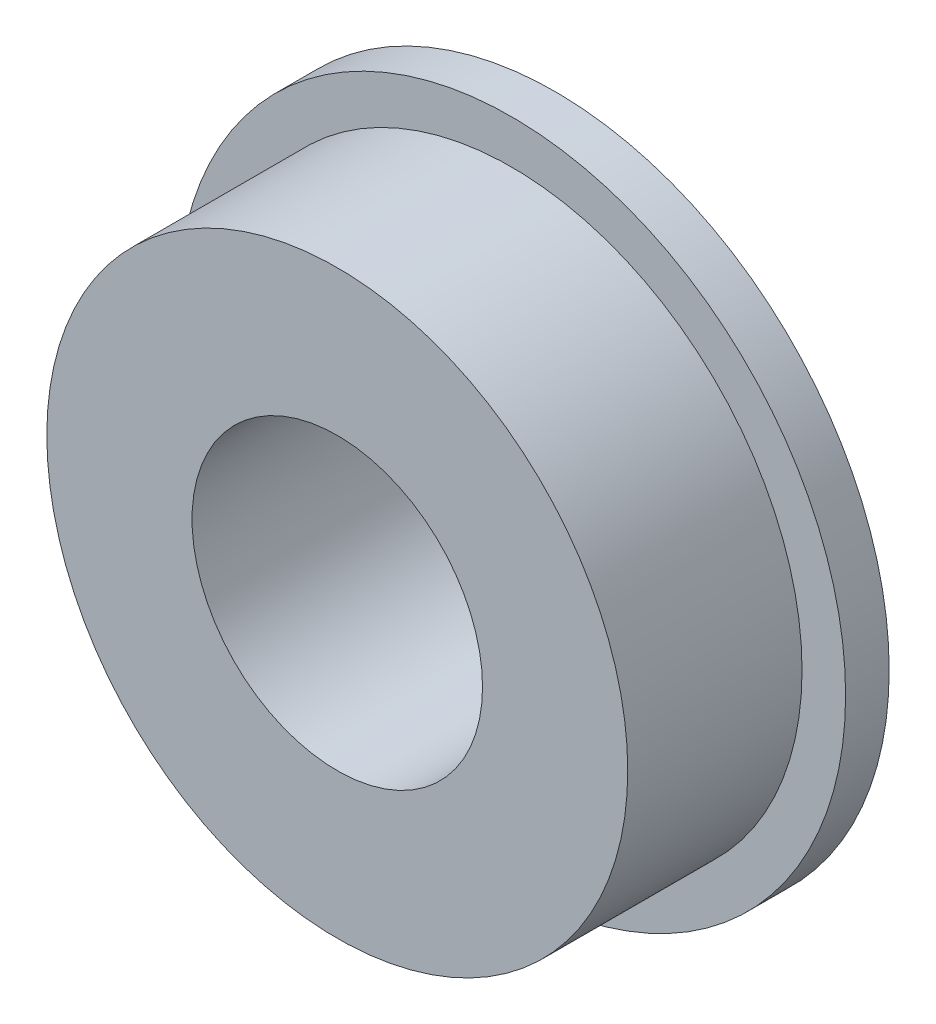
ISO-10303-21;
HEADER;
FILE_DESCRIPTION(('STEP AP214'),'2;1');
FILE_NAME('part.step','',(''),(''),'','','');
FILE_SCHEMA(('AUTOMOTIVE_DESIGN { 1 0 10303 214 1 1 1 1 }'));
ENDSEC;
DATA;
#1=APPLICATION_CONTEXT('core data for automotive mechanical design processes');
#2=APPLICATION_PROTOCOL_DEFINITION('international standard','automotive_design',2000,#1);
#3=PRODUCT_CONTEXT('',#1,'mechanical');
#4=PRODUCT('Part','Part','',(#3));
#5=PRODUCT_RELATED_PRODUCT_CATEGORY('part','',(#4));
#6=PRODUCT_DEFINITION_FORMATION('','',#4);
#7=PRODUCT_DEFINITION_CONTEXT('part definition',#1,'design');
#8=PRODUCT_DEFINITION('design','',#6,#7);
#9=PRODUCT_DEFINITION_SHAPE('','',#8);
#10=(LENGTH_UNIT() NAMED_UNIT(*) SI_UNIT(.MILLI.,.METRE.));
#11=(NAMED_UNIT(*) PLANE_ANGLE_UNIT() SI_UNIT($,.RADIAN.));
#12=(NAMED_UNIT(*) SI_UNIT($,.STERADIAN.) SOLID_ANGLE_UNIT());
#13=UNCERTAINTY_MEASURE_WITH_UNIT(LENGTH_MEASURE(1.E-05),#10,'distance_accuracy_value','');
#14=(GEOMETRIC_REPRESENTATION_CONTEXT(3) GLOBAL_UNCERTAINTY_ASSIGNED_CONTEXT((#13)) GLOBAL_UNIT_ASSIGNED_CONTEXT((#10,
#11,#12)) REPRESENTATION_CONTEXT('',''));
#15=CARTESIAN_POINT('',(0.,0.,0.));
#16=DIRECTION('',(0.,0.,1.));
#17=DIRECTION('',(1.,0.,0.));
#18=AXIS2_PLACEMENT_3D('',#15,#16,#17);
#19=CARTESIAN_POINT('',(0.,0.,0.6));
#20=DIRECTION('',(0.,0.,-1.));
#21=DIRECTION('',(-1.,0.,0.));
#22=AXIS2_PLACEMENT_3D('',#19,#20,#21);
#23=CYLINDRICAL_SURFACE('',#22,4.6);
#24=CARTESIAN_POINT('',(0.,0.,0.6));
#25=DIRECTION('',(0.,0.,1.));
#26=DIRECTION('',(1.,0.,0.));
#27=AXIS2_PLACEMENT_3D('',#24,#25,#26);
#28=CIRCLE('',#27,4.6);
#29=CARTESIAN_POINT('',(4.6,0.,0.6));
#30=VERTEX_POINT('',#29);
#31=EDGE_CURVE('E10',#30,#30,#28,.T.);
#32=ORIENTED_EDGE('',*,*,#31,.F.);
#33=EDGE_LOOP('',(#32));
#34=FACE_BOUND('',#33,.T.);
#35=CARTESIAN_POINT('',(0.,0.,0.));
#36=DIRECTION('',(0.,0.,1.));
#37=DIRECTION('',(1.,0.,0.));
#38=AXIS2_PLACEMENT_3D('',#35,#36,#37);
#39=CIRCLE('',#38,4.6);
#40=CARTESIAN_POINT('',(4.6,0.,0.));
#41=VERTEX_POINT('',#40);
#42=EDGE_CURVE('E35',#41,#41,#39,.T.);
#43=ORIENTED_EDGE('',*,*,#42,.T.);
#44=EDGE_LOOP('',(#43));
#45=FACE_BOUND('',#44,.T.);
#46=ADVANCED_FACE('F32',(#34,#45),#23,.T.);
#47=CARTESIAN_POINT('',(0.,0.,0.6));
#48=DIRECTION('',(0.,0.,1.));
#49=DIRECTION('',(1.,0.,0.));
#50=AXIS2_PLACEMENT_3D('',#47,#48,#49);
#51=PLANE('',#50);
#52=CARTESIAN_POINT('',(0.,0.,0.6));
#53=DIRECTION('',(0.,0.,1.));
#54=DIRECTION('',(1.,0.,0.));
#55=AXIS2_PLACEMENT_3D('',#52,#53,#54);
#56=CIRCLE('',#55,4.);
#57=CARTESIAN_POINT('',(4.,0.,0.6));
#58=VERTEX_POINT('',#57);
#59=EDGE_CURVE('E44',#58,#58,#56,.T.);
#60=ORIENTED_EDGE('',*,*,#59,.F.);
#61=EDGE_LOOP('',(#60));
#62=FACE_BOUND('',#61,.T.);
#63=ORIENTED_EDGE('',*,*,#31,.T.);
#64=EDGE_LOOP('',(#63));
#65=FACE_BOUND('',#64,.T.);
#66=ADVANCED_FACE('F77',(#62,#65),#51,.T.);
#67=CARTESIAN_POINT('',(0.,0.,0.));
#68=DIRECTION('',(0.,0.,1.));
#69=DIRECTION('',(1.,0.,0.));
#70=AXIS2_PLACEMENT_3D('',#67,#68,#69);
#71=PLANE('',#70);
#72=CARTESIAN_POINT('',(0.,0.,0.));
#73=DIRECTION('',(0.,0.,1.));
#74=DIRECTION('',(1.,0.,0.));
#75=AXIS2_PLACEMENT_3D('',#72,#73,#74);
#76=CIRCLE('',#75,2.);
#77=CARTESIAN_POINT('',(2.,0.,0.));
#78=VERTEX_POINT('',#77);
#79=EDGE_CURVE('E47',#78,#78,#76,.T.);
#80=ORIENTED_EDGE('',*,*,#79,.T.);
#81=EDGE_LOOP('',(#80));
#82=FACE_BOUND('',#81,.T.);
#83=ORIENTED_EDGE('',*,*,#42,.F.);
#84=EDGE_LOOP('',(#83));
#85=FACE_BOUND('',#84,.T.);
#86=ADVANCED_FACE('F56',(#82,#85),#71,.F.);
#87=CARTESIAN_POINT('',(0.,0.,3.));
#88=DIRECTION('',(0.,0.,-1.));
#89=DIRECTION('',(-1.,0.,0.));
#90=AXIS2_PLACEMENT_3D('',#87,#88,#89);
#91=CYLINDRICAL_SURFACE('',#90,4.);
#92=CARTESIAN_POINT('',(0.,0.,3.));
#93=DIRECTION('',(0.,0.,1.));
#94=DIRECTION('',(1.,0.,0.));
#95=AXIS2_PLACEMENT_3D('',#92,#93,#94);
#96=CIRCLE('',#95,4.);
#97=CARTESIAN_POINT('',(4.,0.,3.));
#98=VERTEX_POINT('',#97);
#99=EDGE_CURVE('E42',#98,#98,#96,.T.);
#100=ORIENTED_EDGE('',*,*,#99,.F.);
#101=EDGE_LOOP('',(#100));
#102=FACE_BOUND('',#101,.T.);
#103=ORIENTED_EDGE('',*,*,#59,.T.);
#104=EDGE_LOOP('',(#103));
#105=FACE_BOUND('',#104,.T.);
#106=ADVANCED_FACE('F68',(#102,#105),#91,.T.);
#107=CARTESIAN_POINT('',(0.,0.,3.));
#108=DIRECTION('',(0.,0.,1.));
#109=DIRECTION('',(1.,0.,0.));
#110=AXIS2_PLACEMENT_3D('',#107,#108,#109);
#111=PLANE('',#110);
#112=CARTESIAN_POINT('',(0.,0.,3.));
#113=DIRECTION('',(0.,0.,1.));
#114=DIRECTION('',(1.,0.,0.));
#115=AXIS2_PLACEMENT_3D('',#112,#113,#114);
#116=CIRCLE('',#115,2.);
#117=CARTESIAN_POINT('',(2.,0.,3.));
#118=VERTEX_POINT('',#117);
#119=EDGE_CURVE('E50',#118,#118,#116,.T.);
#120=ORIENTED_EDGE('',*,*,#119,.F.);
#121=EDGE_LOOP('',(#120));
#122=FACE_BOUND('',#121,.T.);
#123=ORIENTED_EDGE('',*,*,#99,.T.);
#124=EDGE_LOOP('',(#123));
#125=FACE_BOUND('',#124,.T.);
#126=ADVANCED_FACE('F62',(#122,#125),#111,.T.);
#127=CARTESIAN_POINT('',(0.,0.,0.));
#128=DIRECTION('',(0.,0.,1.));
#129=DIRECTION('',(1.,0.,0.));
#130=AXIS2_PLACEMENT_3D('',#127,#128,#129);
#131=CYLINDRICAL_SURFACE('',#130,2.);
#132=ORIENTED_EDGE('',*,*,#79,.F.);
#133=EDGE_LOOP('',(#132));
#134=FACE_BOUND('',#133,.T.);
#135=ORIENTED_EDGE('',*,*,#119,.T.);
#136=EDGE_LOOP('',(#135));
#137=FACE_BOUND('',#136,.T.);
#138=ADVANCED_FACE('F59',(#134,#137),#131,.F.);
#139=CLOSED_SHELL('',(#46,#66,#86,#106,#126,#138));
#140=MANIFOLD_SOLID_BREP('B2',#139);
#141=ADVANCED_BREP_SHAPE_REPRESENTATION('',(#18,#140),#14);
#142=SHAPE_DEFINITION_REPRESENTATION(#9,#141);
ENDSEC;
END-ISO-10303-21;
